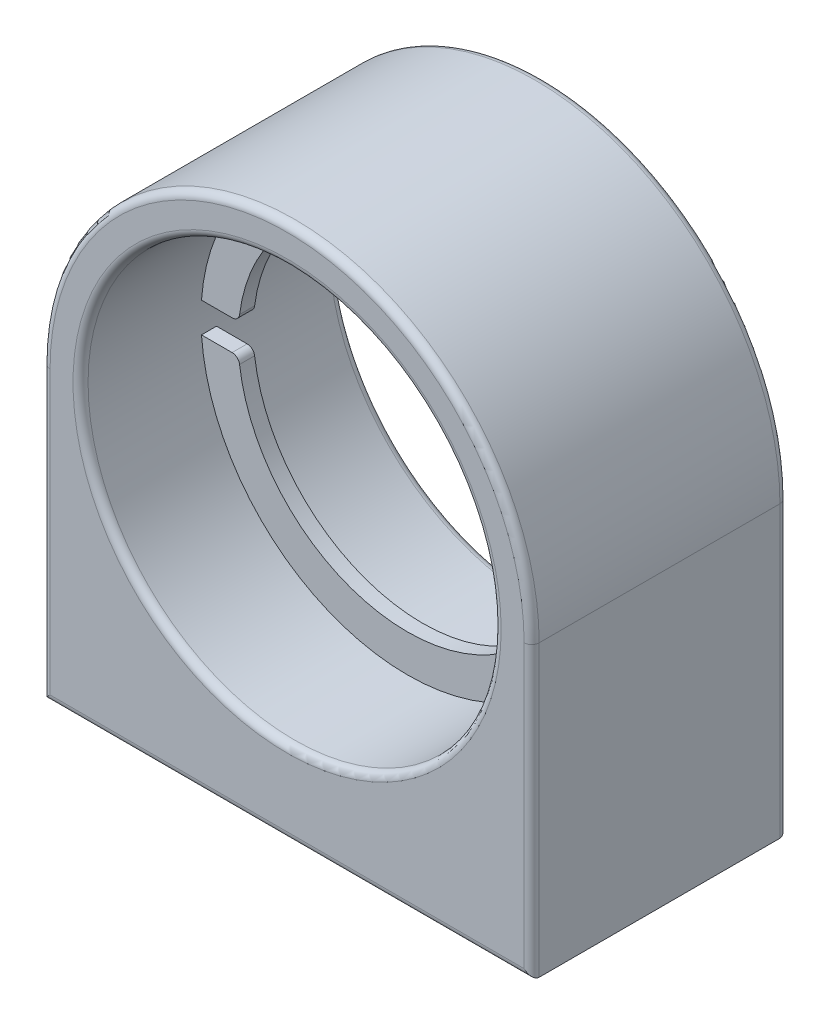
ISO-10303-21;
HEADER;
FILE_DESCRIPTION(('STEP AP214'),'2;1');
FILE_NAME('part.step','',(''),(''),'','','');
FILE_SCHEMA(('AUTOMOTIVE_DESIGN { 1 0 10303 214 1 1 1 1 }'));
ENDSEC;
DATA;
#1=APPLICATION_CONTEXT('core data for automotive mechanical design processes');
#2=APPLICATION_PROTOCOL_DEFINITION('international standard','automotive_design',2000,#1);
#3=PRODUCT_CONTEXT('',#1,'mechanical');
#4=PRODUCT('Part','Part','',(#3));
#5=PRODUCT_RELATED_PRODUCT_CATEGORY('part','',(#4));
#6=PRODUCT_DEFINITION_FORMATION('','',#4);
#7=PRODUCT_DEFINITION_CONTEXT('part definition',#1,'design');
#8=PRODUCT_DEFINITION('design','',#6,#7);
#9=PRODUCT_DEFINITION_SHAPE('','',#8);
#10=(LENGTH_UNIT() NAMED_UNIT(*) SI_UNIT(.MILLI.,.METRE.));
#11=(NAMED_UNIT(*) PLANE_ANGLE_UNIT() SI_UNIT($,.RADIAN.));
#12=(NAMED_UNIT(*) SI_UNIT($,.STERADIAN.) SOLID_ANGLE_UNIT());
#13=UNCERTAINTY_MEASURE_WITH_UNIT(LENGTH_MEASURE(1.E-05),#10,'distance_accuracy_value','');
#14=(GEOMETRIC_REPRESENTATION_CONTEXT(3) GLOBAL_UNCERTAINTY_ASSIGNED_CONTEXT((#13)) GLOBAL_UNIT_ASSIGNED_CONTEXT((#10,
#11,#12)) REPRESENTATION_CONTEXT('',''));
#15=CARTESIAN_POINT('',(0.,0.,0.));
#16=DIRECTION('',(0.,0.,1.));
#17=DIRECTION('',(1.,0.,0.));
#18=AXIS2_PLACEMENT_3D('',#15,#16,#17);
#19=CARTESIAN_POINT('',(0.,19.25,17.));
#20=DIRECTION('',(0.,0.,-1.));
#21=DIRECTION('',(-1.,0.,0.));
#22=AXIS2_PLACEMENT_3D('',#19,#20,#21);
#23=CYLINDRICAL_SURFACE('',#22,22.5);
#24=CARTESIAN_POINT('',(0.,19.25,-1.));
#25=DIRECTION('',(0.,0.,-1.));
#26=DIRECTION('',(-1.,0.,0.));
#27=AXIS2_PLACEMENT_3D('',#24,#25,#26);
#28=CIRCLE('',#27,22.5);
#29=CARTESIAN_POINT('',(-22.3159059972894,22.1223404255319,-1.));
#30=VERTEX_POINT('',#29);
#31=CARTESIAN_POINT('',(22.3159059972894,22.1223404255319,-1.));
#32=VERTEX_POINT('',#31);
#33=EDGE_CURVE('E243',#30,#32,#28,.T.);
#34=ORIENTED_EDGE('',*,*,#33,.T.);
#35=DIRECTION('',(0.,0.,-1.));
#36=VECTOR('',#35,1.);
#37=CARTESIAN_POINT('',(22.3159059972894,22.1223404255319,17.));
#38=LINE('',#37,#36);
#39=CARTESIAN_POINT('',(22.3159059972894,22.1223404255319,1.));
#40=VERTEX_POINT('',#39);
#41=EDGE_CURVE('E323',#32,#40,#38,.F.);
#42=ORIENTED_EDGE('',*,*,#41,.T.);
#43=CARTESIAN_POINT('',(0.,19.25,1.));
#44=DIRECTION('',(0.,0.,1.));
#45=DIRECTION('',(1.,0.,0.));
#46=AXIS2_PLACEMENT_3D('',#43,#44,#45);
#47=CIRCLE('',#46,22.5);
#48=CARTESIAN_POINT('',(-22.3159059972894,22.1223404255319,1.));
#49=VERTEX_POINT('',#48);
#50=EDGE_CURVE('E231',#40,#49,#47,.T.);
#51=ORIENTED_EDGE('',*,*,#50,.T.);
#52=DIRECTION('',(0.,0.,-1.));
#53=VECTOR('',#52,1.);
#54=CARTESIAN_POINT('',(-22.3159059972894,22.1223404255319,17.));
#55=LINE('',#54,#53);
#56=EDGE_CURVE('E321',#49,#30,#55,.T.);
#57=ORIENTED_EDGE('',*,*,#56,.T.);
#58=EDGE_LOOP('',(#34,#42,#51,#57));
#59=FACE_BOUND('',#58,.T.);
#60=ADVANCED_FACE('F41',(#59),#23,.F.);
#61=CARTESIAN_POINT('',(0.,19.25,1.));
#62=DIRECTION('',(0.,0.,1.));
#63=DIRECTION('',(1.,0.,0.));
#64=AXIS2_PLACEMENT_3D('',#61,#62,#63);
#65=PLANE('',#64);
#66=ORIENTED_EDGE('',*,*,#50,.F.);
#67=CARTESIAN_POINT('',(23.3077240416133,22.25,1.));
#68=DIRECTION('',(0.,0.,1.));
#69=DIRECTION('',(1.,0.,0.));
#70=AXIS2_PLACEMENT_3D('',#67,#68,#69);
#71=CIRCLE('',#70,1.);
#72=CARTESIAN_POINT('',(23.3077240416133,21.25,1.));
#73=VERTEX_POINT('',#72);
#74=EDGE_CURVE('E328',#40,#73,#71,.T.);
#75=ORIENTED_EDGE('',*,*,#74,.T.);
#76=DIRECTION('',(1.,0.,0.));
#77=VECTOR('',#76,1.);
#78=CARTESIAN_POINT('',(0.,21.25,1.));
#79=LINE('',#78,#77);
#80=CARTESIAN_POINT('',(27.3770433027382,21.25,1.));
#81=VERTEX_POINT('',#80);
#82=EDGE_CURVE('E476',#73,#81,#79,.T.);
#83=ORIENTED_EDGE('',*,*,#82,.T.);
#84=CARTESIAN_POINT('',(0.,19.25,1.));
#85=DIRECTION('',(0.,0.,1.));
#86=DIRECTION('',(1.,0.,0.));
#87=AXIS2_PLACEMENT_3D('',#84,#85,#86);
#88=CIRCLE('',#87,27.45);
#89=CARTESIAN_POINT('',(-27.3770433027382,21.25,1.));
#90=VERTEX_POINT('',#89);
#91=EDGE_CURVE('E223',#81,#90,#88,.T.);
#92=ORIENTED_EDGE('',*,*,#91,.T.);
#93=DIRECTION('',(1.,0.,0.));
#94=VECTOR('',#93,1.);
#95=CARTESIAN_POINT('',(0.,21.25,1.));
#96=LINE('',#95,#94);
#97=CARTESIAN_POINT('',(-23.3077240416133,21.25,1.));
#98=VERTEX_POINT('',#97);
#99=EDGE_CURVE('E484',#90,#98,#96,.T.);
#100=ORIENTED_EDGE('',*,*,#99,.T.);
#101=CARTESIAN_POINT('',(-23.3077240416133,22.25,1.));
#102=DIRECTION('',(0.,0.,1.));
#103=DIRECTION('',(1.,0.,0.));
#104=AXIS2_PLACEMENT_3D('',#101,#102,#103);
#105=CIRCLE('',#104,1.);
#106=EDGE_CURVE('E326',#98,#49,#105,.T.);
#107=ORIENTED_EDGE('',*,*,#106,.T.);
#108=EDGE_LOOP('',(#66,#75,#83,#92,#100,#107));
#109=FACE_BOUND('',#108,.T.);
#110=ADVANCED_FACE('F432',(#109),#65,.T.);
#111=CARTESIAN_POINT('',(0.,19.25,-1.));
#112=DIRECTION('',(0.,0.,-1.));
#113=DIRECTION('',(1.,0.,0.));
#114=AXIS2_PLACEMENT_3D('',#111,#112,#113);
#115=PLANE('',#114);
#116=DIRECTION('',(1.,0.,0.));
#117=VECTOR('',#116,1.);
#118=CARTESIAN_POINT('',(0.,21.25,-1.));
#119=LINE('',#118,#117);
#120=CARTESIAN_POINT('',(23.3077240416133,21.25,-1.));
#121=VERTEX_POINT('',#120);
#122=CARTESIAN_POINT('',(27.3770433027382,21.25,-1.));
#123=VERTEX_POINT('',#122);
#124=EDGE_CURVE('E356',#121,#123,#119,.T.);
#125=ORIENTED_EDGE('',*,*,#124,.F.);
#126=CARTESIAN_POINT('',(23.3077240416133,22.25,-1.));
#127=DIRECTION('',(0.,0.,-1.));
#128=DIRECTION('',(-1.,0.,0.));
#129=AXIS2_PLACEMENT_3D('',#126,#127,#128);
#130=CIRCLE('',#129,1.);
#131=EDGE_CURVE('E332',#121,#32,#130,.T.);
#132=ORIENTED_EDGE('',*,*,#131,.T.);
#133=ORIENTED_EDGE('',*,*,#33,.F.);
#134=CARTESIAN_POINT('',(-23.3077240416133,22.25,-1.));
#135=DIRECTION('',(0.,0.,-1.));
#136=DIRECTION('',(-1.,0.,0.));
#137=AXIS2_PLACEMENT_3D('',#134,#135,#136);
#138=CIRCLE('',#137,1.);
#139=CARTESIAN_POINT('',(-23.3077240416133,21.25,-1.));
#140=VERTEX_POINT('',#139);
#141=EDGE_CURVE('E58',#30,#140,#138,.T.);
#142=ORIENTED_EDGE('',*,*,#141,.T.);
#143=DIRECTION('',(1.,0.,0.));
#144=VECTOR('',#143,1.);
#145=CARTESIAN_POINT('',(0.,21.25,-1.));
#146=LINE('',#145,#144);
#147=CARTESIAN_POINT('',(-27.3770433027382,21.25,-1.));
#148=VERTEX_POINT('',#147);
#149=EDGE_CURVE('E493',#148,#140,#146,.T.);
#150=ORIENTED_EDGE('',*,*,#149,.F.);
#151=CARTESIAN_POINT('',(0.,19.25,-1.));
#152=DIRECTION('',(0.,0.,1.));
#153=DIRECTION('',(1.,0.,0.));
#154=AXIS2_PLACEMENT_3D('',#151,#152,#153);
#155=CIRCLE('',#154,27.45);
#156=EDGE_CURVE('E211',#123,#148,#155,.T.);
#157=ORIENTED_EDGE('',*,*,#156,.F.);
#158=EDGE_LOOP('',(#125,#132,#133,#142,#150,#157));
#159=FACE_BOUND('',#158,.T.);
#160=ADVANCED_FACE('F440',(#159),#115,.T.);
#161=CARTESIAN_POINT('',(-22.3159059972894,16.3776595744681,1.));
#162=VERTEX_POINT('',#161);
#163=CARTESIAN_POINT('',(22.3159059972894,16.3776595744681,1.));
#164=VERTEX_POINT('',#163);
#165=EDGE_CURVE('E226',#162,#164,#47,.T.);
#166=ORIENTED_EDGE('',*,*,#165,.T.);
#167=DIRECTION('',(0.,0.,-1.));
#168=VECTOR('',#167,1.);
#169=CARTESIAN_POINT('',(22.3159059972894,16.3776595744681,17.));
#170=LINE('',#169,#168);
#171=CARTESIAN_POINT('',(22.3159059972894,16.3776595744681,-1.));
#172=VERTEX_POINT('',#171);
#173=EDGE_CURVE('E315',#164,#172,#170,.T.);
#174=ORIENTED_EDGE('',*,*,#173,.T.);
#175=CARTESIAN_POINT('',(-22.3159059972894,16.3776595744681,-1.));
#176=VERTEX_POINT('',#175);
#177=EDGE_CURVE('E215',#172,#176,#28,.T.);
#178=ORIENTED_EDGE('',*,*,#177,.T.);
#179=DIRECTION('',(0.,0.,-1.));
#180=VECTOR('',#179,1.);
#181=CARTESIAN_POINT('',(-22.3159059972894,16.3776595744681,17.));
#182=LINE('',#181,#180);
#183=EDGE_CURVE('E312',#176,#162,#182,.F.);
#184=ORIENTED_EDGE('',*,*,#183,.T.);
#185=EDGE_LOOP('',(#166,#174,#178,#184));
#186=FACE_BOUND('',#185,.T.);
#187=ADVANCED_FACE('F435',(#186),#23,.F.);
#188=CARTESIAN_POINT('',(0.,19.25,17.));
#189=DIRECTION('',(0.,0.,-1.));
#190=DIRECTION('',(-1.,0.,0.));
#191=AXIS2_PLACEMENT_3D('',#188,#189,#190);
#192=CYLINDRICAL_SURFACE('',#191,32.5);
#193=DIRECTION('',(0.,0.,-1.));
#194=VECTOR('',#193,1.);
#195=CARTESIAN_POINT('',(32.5,19.25,17.));
#196=LINE('',#195,#194);
#197=CARTESIAN_POINT('',(32.5,19.25,16.));
#198=VERTEX_POINT('',#197);
#199=CARTESIAN_POINT('',(32.5,19.25,-16.));
#200=VERTEX_POINT('',#199);
#201=EDGE_CURVE('E227',#198,#200,#196,.T.);
#202=ORIENTED_EDGE('',*,*,#201,.T.);
#203=CARTESIAN_POINT('',(0.,19.25,-16.));
#204=DIRECTION('',(0.,0.,1.));
#205=DIRECTION('',(1.,0.,0.));
#206=AXIS2_PLACEMENT_3D('',#203,#204,#205);
#207=CIRCLE('',#206,32.5);
#208=CARTESIAN_POINT('',(-32.5,19.25,-16.));
#209=VERTEX_POINT('',#208);
#210=EDGE_CURVE('E285',#200,#209,#207,.T.);
#211=ORIENTED_EDGE('',*,*,#210,.T.);
#212=DIRECTION('',(0.,0.,-1.));
#213=VECTOR('',#212,1.);
#214=CARTESIAN_POINT('',(-32.5,19.25,17.));
#215=LINE('',#214,#213);
#216=CARTESIAN_POINT('',(-32.5,19.25,16.));
#217=VERTEX_POINT('',#216);
#218=EDGE_CURVE('E237',#217,#209,#215,.T.);
#219=ORIENTED_EDGE('',*,*,#218,.F.);
#220=CARTESIAN_POINT('',(0.,19.25,16.));
#221=DIRECTION('',(0.,0.,1.));
#222=DIRECTION('',(1.,0.,0.));
#223=AXIS2_PLACEMENT_3D('',#220,#221,#222);
#224=CIRCLE('',#223,32.5);
#225=EDGE_CURVE('E283',#217,#198,#224,.F.);
#226=ORIENTED_EDGE('',*,*,#225,.T.);
#227=EDGE_LOOP('',(#202,#211,#219,#226));
#228=FACE_BOUND('',#227,.T.);
#229=ADVANCED_FACE('F383',(#228),#192,.T.);
#230=CARTESIAN_POINT('',(-32.5,0.,17.));
#231=DIRECTION('',(-1.,0.,0.));
#232=DIRECTION('',(0.,0.,1.));
#233=AXIS2_PLACEMENT_3D('',#230,#231,#232);
#234=PLANE('',#233);
#235=ORIENTED_EDGE('',*,*,#218,.T.);
#236=DIRECTION('',(0.,1.,0.));
#237=VECTOR('',#236,1.);
#238=CARTESIAN_POINT('',(-32.5,-19.25,-16.));
#239=LINE('',#238,#237);
#240=CARTESIAN_POINT('',(-32.5,-19.25,-16.));
#241=VERTEX_POINT('',#240);
#242=EDGE_CURVE('E259',#209,#241,#239,.F.);
#243=ORIENTED_EDGE('',*,*,#242,.T.);
#244=DIRECTION('',(0.,0.,-1.));
#245=VECTOR('',#244,1.);
#246=CARTESIAN_POINT('',(-32.5,-19.25,17.));
#247=LINE('',#246,#245);
#248=CARTESIAN_POINT('',(-32.5,-19.25,16.));
#249=VERTEX_POINT('',#248);
#250=EDGE_CURVE('E234',#249,#241,#247,.T.);
#251=ORIENTED_EDGE('',*,*,#250,.F.);
#252=DIRECTION('',(0.,1.,0.));
#253=VECTOR('',#252,1.);
#254=CARTESIAN_POINT('',(-32.5,0.,16.));
#255=LINE('',#254,#253);
#256=EDGE_CURVE('E257',#249,#217,#255,.T.);
#257=ORIENTED_EDGE('',*,*,#256,.T.);
#258=EDGE_LOOP('',(#235,#243,#251,#257));
#259=FACE_BOUND('',#258,.T.);
#260=ADVANCED_FACE('F380',(#259),#234,.T.);
#261=CARTESIAN_POINT('',(0.,-19.25,17.));
#262=DIRECTION('',(0.,1.,0.));
#263=DIRECTION('',(0.,0.,1.));
#264=AXIS2_PLACEMENT_3D('',#261,#262,#263);
#265=PLANE('',#264);
#266=CARTESIAN_POINT('',(22.5,-19.25,0.));
#267=DIRECTION('',(0.,1.,0.));
#268=DIRECTION('',(0.,0.,1.));
#269=AXIS2_PLACEMENT_3D('',#266,#267,#268);
#270=CIRCLE('',#269,3.8);
#271=CARTESIAN_POINT('',(22.5,-19.25,3.8));
#272=VERTEX_POINT('',#271);
#273=EDGE_CURVE('E271',#272,#272,#270,.T.);
#274=ORIENTED_EDGE('',*,*,#273,.T.);
#275=EDGE_LOOP('',(#274));
#276=FACE_BOUND('',#275,.T.);
#277=CARTESIAN_POINT('',(10.,-19.25,0.));
#278=DIRECTION('',(0.,1.,0.));
#279=DIRECTION('',(0.,0.,1.));
#280=AXIS2_PLACEMENT_3D('',#277,#278,#279);
#281=CIRCLE('',#280,3.8);
#282=CARTESIAN_POINT('',(10.,-19.25,3.8));
#283=VERTEX_POINT('',#282);
#284=EDGE_CURVE('E268',#283,#283,#281,.T.);
#285=ORIENTED_EDGE('',*,*,#284,.T.);
#286=EDGE_LOOP('',(#285));
#287=FACE_BOUND('',#286,.T.);
#288=CARTESIAN_POINT('',(-10.,-19.25,0.));
#289=DIRECTION('',(0.,1.,0.));
#290=DIRECTION('',(0.,0.,1.));
#291=AXIS2_PLACEMENT_3D('',#288,#289,#290);
#292=CIRCLE('',#291,3.8);
#293=CARTESIAN_POINT('',(-10.,-19.25,3.8));
#294=VERTEX_POINT('',#293);
#295=EDGE_CURVE('E265',#294,#294,#292,.T.);
#296=ORIENTED_EDGE('',*,*,#295,.T.);
#297=EDGE_LOOP('',(#296));
#298=FACE_BOUND('',#297,.T.);
#299=CARTESIAN_POINT('',(-22.5,-19.25,0.));
#300=DIRECTION('',(0.,1.,0.));
#301=DIRECTION('',(0.,0.,1.));
#302=AXIS2_PLACEMENT_3D('',#299,#300,#301);
#303=CIRCLE('',#302,3.8);
#304=CARTESIAN_POINT('',(-22.5,-19.25,3.8));
#305=VERTEX_POINT('',#304);
#306=EDGE_CURVE('E262',#305,#305,#303,.T.);
#307=ORIENTED_EDGE('',*,*,#306,.T.);
#308=EDGE_LOOP('',(#307));
#309=FACE_BOUND('',#308,.T.);
#310=ORIENTED_EDGE('',*,*,#250,.T.);
#311=DIRECTION('',(1.,0.,0.));
#312=VECTOR('',#311,1.);
#313=CARTESIAN_POINT('',(0.,-19.25,-16.));
#314=LINE('',#313,#312);
#315=CARTESIAN_POINT('',(32.5,-19.25,-16.));
#316=VERTEX_POINT('',#315);
#317=EDGE_CURVE('E276',#241,#316,#314,.T.);
#318=ORIENTED_EDGE('',*,*,#317,.T.);
#319=DIRECTION('',(0.,0.,-1.));
#320=VECTOR('',#319,1.);
#321=CARTESIAN_POINT('',(32.5,-19.25,17.));
#322=LINE('',#321,#320);
#323=CARTESIAN_POINT('',(32.5,-19.25,16.));
#324=VERTEX_POINT('',#323);
#325=EDGE_CURVE('E230',#324,#316,#322,.T.);
#326=ORIENTED_EDGE('',*,*,#325,.F.);
#327=DIRECTION('',(1.,0.,0.));
#328=VECTOR('',#327,1.);
#329=CARTESIAN_POINT('',(-32.5,-19.25,16.));
#330=LINE('',#329,#328);
#331=EDGE_CURVE('E274',#324,#249,#330,.F.);
#332=ORIENTED_EDGE('',*,*,#331,.T.);
#333=EDGE_LOOP('',(#310,#318,#326,#332));
#334=FACE_BOUND('',#333,.T.);
#335=ADVANCED_FACE('F397',(#276,#287,#298,#309,#334),#265,.F.);
#336=CARTESIAN_POINT('',(32.5,0.,17.));
#337=DIRECTION('',(-1.,0.,0.));
#338=DIRECTION('',(0.,0.,1.));
#339=AXIS2_PLACEMENT_3D('',#336,#337,#338);
#340=PLANE('',#339);
#341=ORIENTED_EDGE('',*,*,#325,.T.);
#342=DIRECTION('',(0.,1.,0.));
#343=VECTOR('',#342,1.);
#344=CARTESIAN_POINT('',(32.5,0.,-16.));
#345=LINE('',#344,#343);
#346=EDGE_CURVE('E281',#316,#200,#345,.T.);
#347=ORIENTED_EDGE('',*,*,#346,.T.);
#348=ORIENTED_EDGE('',*,*,#201,.F.);
#349=DIRECTION('',(0.,1.,0.));
#350=VECTOR('',#349,1.);
#351=CARTESIAN_POINT('',(32.5,-19.25,16.));
#352=LINE('',#351,#350);
#353=EDGE_CURVE('E278',#198,#324,#352,.F.);
#354=ORIENTED_EDGE('',*,*,#353,.T.);
#355=EDGE_LOOP('',(#341,#347,#348,#354));
#356=FACE_BOUND('',#355,.T.);
#357=ADVANCED_FACE('F401',(#356),#340,.F.);
#358=CARTESIAN_POINT('',(0.,0.,17.));
#359=DIRECTION('',(0.,0.,1.));
#360=DIRECTION('',(1.,0.,0.));
#361=AXIS2_PLACEMENT_3D('',#358,#359,#360);
#362=PLANE('',#361);
#363=DIRECTION('',(1.,0.,0.));
#364=VECTOR('',#363,1.);
#365=CARTESIAN_POINT('',(32.5,-18.25,17.));
#366=LINE('',#365,#364);
#367=CARTESIAN_POINT('',(-31.5,-18.25,17.));
#368=VERTEX_POINT('',#367);
#369=CARTESIAN_POINT('',(31.5,-18.25,17.));
#370=VERTEX_POINT('',#369);
#371=EDGE_CURVE('E300',#368,#370,#366,.T.);
#372=ORIENTED_EDGE('',*,*,#371,.T.);
#373=DIRECTION('',(0.,1.,0.));
#374=VECTOR('',#373,1.);
#375=CARTESIAN_POINT('',(31.5,19.25,17.));
#376=LINE('',#375,#374);
#377=CARTESIAN_POINT('',(31.5,19.25,17.));
#378=VERTEX_POINT('',#377);
#379=EDGE_CURVE('E302',#370,#378,#376,.T.);
#380=ORIENTED_EDGE('',*,*,#379,.T.);
#381=CARTESIAN_POINT('',(0.,19.25,17.));
#382=DIRECTION('',(0.,0.,1.));
#383=DIRECTION('',(1.,0.,0.));
#384=AXIS2_PLACEMENT_3D('',#381,#382,#383);
#385=CIRCLE('',#384,31.5);
#386=CARTESIAN_POINT('',(-31.5,19.25,17.));
#387=VERTEX_POINT('',#386);
#388=EDGE_CURVE('E296',#378,#387,#385,.T.);
#389=ORIENTED_EDGE('',*,*,#388,.T.);
#390=DIRECTION('',(0.,1.,0.));
#391=VECTOR('',#390,1.);
#392=CARTESIAN_POINT('',(-31.5,0.,17.));
#393=LINE('',#392,#391);
#394=EDGE_CURVE('E298',#387,#368,#393,.F.);
#395=ORIENTED_EDGE('',*,*,#394,.T.);
#396=EDGE_LOOP('',(#372,#380,#389,#395));
#397=FACE_BOUND('',#396,.T.);
#398=CARTESIAN_POINT('',(0.,19.25,17.));
#399=DIRECTION('',(0.,0.,1.));
#400=DIRECTION('',(1.,0.,0.));
#401=AXIS2_PLACEMENT_3D('',#398,#399,#400);
#402=CIRCLE('',#401,28.45);
#403=CARTESIAN_POINT('',(28.45,19.25,17.));
#404=VERTEX_POINT('',#403);
#405=EDGE_CURVE('E293',#404,#404,#402,.F.);
#406=ORIENTED_EDGE('',*,*,#405,.T.);
#407=EDGE_LOOP('',(#406));
#408=FACE_BOUND('',#407,.T.);
#409=ADVANCED_FACE('F414',(#397,#408),#362,.T.);
#410=CARTESIAN_POINT('',(0.,0.,-17.));
#411=DIRECTION('',(0.,0.,1.));
#412=DIRECTION('',(1.,0.,0.));
#413=AXIS2_PLACEMENT_3D('',#410,#411,#412);
#414=PLANE('',#413);
#415=DIRECTION('',(1.,0.,0.));
#416=VECTOR('',#415,1.);
#417=CARTESIAN_POINT('',(0.,-18.25,-17.));
#418=LINE('',#417,#416);
#419=CARTESIAN_POINT('',(31.5,-18.25,-17.));
#420=VERTEX_POINT('',#419);
#421=CARTESIAN_POINT('',(-31.5,-18.25,-17.));
#422=VERTEX_POINT('',#421);
#423=EDGE_CURVE('E252',#420,#422,#418,.F.);
#424=ORIENTED_EDGE('',*,*,#423,.T.);
#425=DIRECTION('',(0.,1.,0.));
#426=VECTOR('',#425,1.);
#427=CARTESIAN_POINT('',(-31.5,19.25,-17.));
#428=LINE('',#427,#426);
#429=CARTESIAN_POINT('',(-31.5,19.25,-17.));
#430=VERTEX_POINT('',#429);
#431=EDGE_CURVE('E254',#422,#430,#428,.T.);
#432=ORIENTED_EDGE('',*,*,#431,.T.);
#433=CARTESIAN_POINT('',(0.,19.25,-17.));
#434=DIRECTION('',(0.,0.,1.));
#435=DIRECTION('',(1.,0.,0.));
#436=AXIS2_PLACEMENT_3D('',#433,#434,#435);
#437=CIRCLE('',#436,31.5);
#438=CARTESIAN_POINT('',(31.5,19.25,-17.));
#439=VERTEX_POINT('',#438);
#440=EDGE_CURVE('E248',#430,#439,#437,.F.);
#441=ORIENTED_EDGE('',*,*,#440,.T.);
#442=DIRECTION('',(0.,1.,0.));
#443=VECTOR('',#442,1.);
#444=CARTESIAN_POINT('',(31.5,0.,-17.));
#445=LINE('',#444,#443);
#446=EDGE_CURVE('E250',#439,#420,#445,.F.);
#447=ORIENTED_EDGE('',*,*,#446,.T.);
#448=EDGE_LOOP('',(#424,#432,#441,#447));
#449=FACE_BOUND('',#448,.T.);
#450=CARTESIAN_POINT('',(0.,19.25,-17.));
#451=DIRECTION('',(0.,0.,1.));
#452=DIRECTION('',(1.,0.,0.));
#453=AXIS2_PLACEMENT_3D('',#450,#451,#452);
#454=CIRCLE('',#453,28.45);
#455=CARTESIAN_POINT('',(28.45,19.25,-17.));
#456=VERTEX_POINT('',#455);
#457=EDGE_CURVE('E240',#456,#456,#454,.T.);
#458=ORIENTED_EDGE('',*,*,#457,.T.);
#459=EDGE_LOOP('',(#458));
#460=FACE_BOUND('',#459,.T.);
#461=ADVANCED_FACE('F411',(#449,#460),#414,.F.);
#462=CARTESIAN_POINT('',(0.,19.25,1.));
#463=DIRECTION('',(0.,0.,1.));
#464=DIRECTION('',(1.,0.,0.));
#465=AXIS2_PLACEMENT_3D('',#462,#463,#464);
#466=CYLINDRICAL_SURFACE('',#465,27.45);
#467=CARTESIAN_POINT('',(0.,19.25,-16.));
#468=DIRECTION('',(0.,0.,1.));
#469=DIRECTION('',(1.,0.,0.));
#470=AXIS2_PLACEMENT_3D('',#467,#468,#469);
#471=CIRCLE('',#470,27.45);
#472=CARTESIAN_POINT('',(27.45,19.25,-16.));
#473=VERTEX_POINT('',#472);
#474=EDGE_CURVE('E290',#473,#473,#471,.F.);
#475=ORIENTED_EDGE('',*,*,#474,.T.);
#476=EDGE_LOOP('',(#475));
#477=FACE_BOUND('',#476,.T.);
#478=CARTESIAN_POINT('',(0.,19.25,16.));
#479=DIRECTION('',(0.,0.,1.));
#480=DIRECTION('',(1.,0.,0.));
#481=AXIS2_PLACEMENT_3D('',#478,#479,#480);
#482=CIRCLE('',#481,27.45);
#483=CARTESIAN_POINT('',(27.45,19.25,16.));
#484=VERTEX_POINT('',#483);
#485=EDGE_CURVE('E287',#484,#484,#482,.T.);
#486=ORIENTED_EDGE('',*,*,#485,.T.);
#487=EDGE_LOOP('',(#486));
#488=FACE_BOUND('',#487,.T.);
#489=CARTESIAN_POINT('',(-27.3770433027382,17.25,1.));
#490=VERTEX_POINT('',#489);
#491=CARTESIAN_POINT('',(27.3770433027382,17.25,1.));
#492=VERTEX_POINT('',#491);
#493=EDGE_CURVE('E203',#490,#492,#88,.T.);
#494=ORIENTED_EDGE('',*,*,#493,.F.);
#495=DIRECTION('',(0.,0.,1.));
#496=VECTOR('',#495,1.);
#497=CARTESIAN_POINT('',(-27.3770433027382,17.25,-7.43367529311809));
#498=LINE('',#497,#496);
#499=CARTESIAN_POINT('',(-27.3770433027382,17.25,-1.));
#500=VERTEX_POINT('',#499);
#501=EDGE_CURVE('E186',#500,#490,#498,.T.);
#502=ORIENTED_EDGE('',*,*,#501,.F.);
#503=CARTESIAN_POINT('',(27.3770433027382,17.25,-1.));
#504=VERTEX_POINT('',#503);
#505=EDGE_CURVE('E201',#500,#504,#155,.T.);
#506=ORIENTED_EDGE('',*,*,#505,.T.);
#507=DIRECTION('',(0.,0.,1.));
#508=VECTOR('',#507,1.);
#509=CARTESIAN_POINT('',(27.3770433027382,17.25,-7.43367529311809));
#510=LINE('',#509,#508);
#511=EDGE_CURVE('E466',#504,#492,#510,.T.);
#512=ORIENTED_EDGE('',*,*,#511,.T.);
#513=EDGE_LOOP('',(#494,#502,#506,#512));
#514=FACE_BOUND('',#513,.T.);
#515=ORIENTED_EDGE('',*,*,#91,.F.);
#516=DIRECTION('',(0.,0.,1.));
#517=VECTOR('',#516,1.);
#518=CARTESIAN_POINT('',(27.3770433027382,21.25,-7.43367529311809));
#519=LINE('',#518,#517);
#520=EDGE_CURVE('E469',#123,#81,#519,.T.);
#521=ORIENTED_EDGE('',*,*,#520,.F.);
#522=ORIENTED_EDGE('',*,*,#156,.T.);
#523=DIRECTION('',(0.,0.,1.));
#524=VECTOR('',#523,1.);
#525=CARTESIAN_POINT('',(-27.3770433027382,21.25,-7.43367529311809));
#526=LINE('',#525,#524);
#527=EDGE_CURVE('E193',#148,#90,#526,.T.);
#528=ORIENTED_EDGE('',*,*,#527,.T.);
#529=EDGE_LOOP('',(#515,#521,#522,#528));
#530=FACE_BOUND('',#529,.T.);
#531=ADVANCED_FACE('F198',(#477,#488,#514,#530),#466,.F.);
#532=DIRECTION('',(1.,0.,0.));
#533=VECTOR('',#532,1.);
#534=CARTESIAN_POINT('',(0.,17.25,1.));
#535=LINE('',#534,#533);
#536=CARTESIAN_POINT('',(23.3077240416133,17.25,1.));
#537=VERTEX_POINT('',#536);
#538=EDGE_CURVE('E467',#537,#492,#535,.T.);
#539=ORIENTED_EDGE('',*,*,#538,.F.);
#540=CARTESIAN_POINT('',(23.3077240416133,16.25,1.));
#541=DIRECTION('',(0.,0.,1.));
#542=DIRECTION('',(1.,0.,0.));
#543=AXIS2_PLACEMENT_3D('',#540,#541,#542);
#544=CIRCLE('',#543,1.);
#545=EDGE_CURVE('E310',#537,#164,#544,.T.);
#546=ORIENTED_EDGE('',*,*,#545,.T.);
#547=ORIENTED_EDGE('',*,*,#165,.F.);
#548=CARTESIAN_POINT('',(-23.3077240416133,16.25,1.));
#549=DIRECTION('',(0.,0.,1.));
#550=DIRECTION('',(1.,0.,0.));
#551=AXIS2_PLACEMENT_3D('',#548,#549,#550);
#552=CIRCLE('',#551,1.);
#553=CARTESIAN_POINT('',(-23.3077240416133,17.25,1.));
#554=VERTEX_POINT('',#553);
#555=EDGE_CURVE('E308',#162,#554,#552,.T.);
#556=ORIENTED_EDGE('',*,*,#555,.T.);
#557=DIRECTION('',(1.,0.,0.));
#558=VECTOR('',#557,1.);
#559=CARTESIAN_POINT('',(0.,17.25,1.));
#560=LINE('',#559,#558);
#561=EDGE_CURVE('E204',#490,#554,#560,.T.);
#562=ORIENTED_EDGE('',*,*,#561,.F.);
#563=ORIENTED_EDGE('',*,*,#493,.T.);
#564=EDGE_LOOP('',(#539,#546,#547,#556,#562,#563));
#565=FACE_BOUND('',#564,.T.);
#566=ADVANCED_FACE('F443',(#565),#65,.T.);
#567=ORIENTED_EDGE('',*,*,#177,.F.);
#568=CARTESIAN_POINT('',(23.3077240416133,16.25,-1.));
#569=DIRECTION('',(0.,0.,-1.));
#570=DIRECTION('',(-1.,0.,0.));
#571=AXIS2_PLACEMENT_3D('',#568,#569,#570);
#572=CIRCLE('',#571,1.);
#573=CARTESIAN_POINT('',(23.3077240416133,17.25,-1.));
#574=VERTEX_POINT('',#573);
#575=EDGE_CURVE('E319',#172,#574,#572,.T.);
#576=ORIENTED_EDGE('',*,*,#575,.T.);
#577=DIRECTION('',(1.,0.,0.));
#578=VECTOR('',#577,1.);
#579=CARTESIAN_POINT('',(0.,17.25,-1.));
#580=LINE('',#579,#578);
#581=EDGE_CURVE('E209',#574,#504,#580,.T.);
#582=ORIENTED_EDGE('',*,*,#581,.T.);
#583=ORIENTED_EDGE('',*,*,#505,.F.);
#584=DIRECTION('',(1.,0.,0.));
#585=VECTOR('',#584,1.);
#586=CARTESIAN_POINT('',(0.,17.25,-1.));
#587=LINE('',#586,#585);
#588=CARTESIAN_POINT('',(-23.3077240416133,17.25,-1.));
#589=VERTEX_POINT('',#588);
#590=EDGE_CURVE('E182',#500,#589,#587,.T.);
#591=ORIENTED_EDGE('',*,*,#590,.T.);
#592=CARTESIAN_POINT('',(-23.3077240416133,16.25,-1.));
#593=DIRECTION('',(0.,0.,-1.));
#594=DIRECTION('',(-1.,0.,0.));
#595=AXIS2_PLACEMENT_3D('',#592,#593,#594);
#596=CIRCLE('',#595,1.);
#597=EDGE_CURVE('E317',#589,#176,#596,.T.);
#598=ORIENTED_EDGE('',*,*,#597,.T.);
#599=EDGE_LOOP('',(#567,#576,#582,#583,#591,#598));
#600=FACE_BOUND('',#599,.T.);
#601=ADVANCED_FACE('F207',(#600),#115,.T.);
#602=CARTESIAN_POINT('',(22.5,-8.25,0.));
#603=DIRECTION('',(0.,-1.,0.));
#604=DIRECTION('',(0.,0.,-1.));
#605=AXIS2_PLACEMENT_3D('',#602,#603,#604);
#606=CYLINDRICAL_SURFACE('',#605,2.8);
#607=CARTESIAN_POINT('',(22.5,-18.25,0.));
#608=DIRECTION('',(0.,1.,0.));
#609=DIRECTION('',(0.,0.,1.));
#610=AXIS2_PLACEMENT_3D('',#607,#608,#609);
#611=CIRCLE('',#610,2.8);
#612=CARTESIAN_POINT('',(22.5,-18.25,2.8));
#613=VERTEX_POINT('',#612);
#614=EDGE_CURVE('E338',#613,#613,#611,.F.);
#615=ORIENTED_EDGE('',*,*,#614,.T.);
#616=EDGE_LOOP('',(#615));
#617=FACE_BOUND('',#616,.T.);
#618=CARTESIAN_POINT('',(22.5,-8.25,0.));
#619=DIRECTION('',(0.,-1.,0.));
#620=DIRECTION('',(0.,0.,1.));
#621=AXIS2_PLACEMENT_3D('',#618,#619,#620);
#622=CIRCLE('',#621,2.8);
#623=CARTESIAN_POINT('',(22.5,-8.25,2.8));
#624=VERTEX_POINT('',#623);
#625=EDGE_CURVE('E221',#624,#624,#622,.T.);
#626=ORIENTED_EDGE('',*,*,#625,.F.);
#627=EDGE_LOOP('',(#626));
#628=FACE_BOUND('',#627,.T.);
#629=ADVANCED_FACE('F567',(#617,#628),#606,.F.);
#630=CARTESIAN_POINT('',(22.5,-8.25,0.));
#631=DIRECTION('',(0.,1.,0.));
#632=DIRECTION('',(0.,0.,1.));
#633=AXIS2_PLACEMENT_3D('',#630,#631,#632);
#634=PLANE('',#633);
#635=ORIENTED_EDGE('',*,*,#625,.T.);
#636=EDGE_LOOP('',(#635));
#637=FACE_BOUND('',#636,.T.);
#638=ADVANCED_FACE('F564',(#637),#634,.F.);
#639=CARTESIAN_POINT('',(10.,-8.25,0.));
#640=DIRECTION('',(0.,-1.,0.));
#641=DIRECTION('',(0.,0.,-1.));
#642=AXIS2_PLACEMENT_3D('',#639,#640,#641);
#643=CYLINDRICAL_SURFACE('',#642,2.8);
#644=CARTESIAN_POINT('',(10.,-18.25,0.));
#645=DIRECTION('',(0.,1.,0.));
#646=DIRECTION('',(0.,0.,1.));
#647=AXIS2_PLACEMENT_3D('',#644,#645,#646);
#648=CIRCLE('',#647,2.8);
#649=CARTESIAN_POINT('',(10.,-18.25,2.8));
#650=VERTEX_POINT('',#649);
#651=EDGE_CURVE('E341',#650,#650,#648,.F.);
#652=ORIENTED_EDGE('',*,*,#651,.T.);
#653=EDGE_LOOP('',(#652));
#654=FACE_BOUND('',#653,.T.);
#655=CARTESIAN_POINT('',(10.,-8.25,0.));
#656=DIRECTION('',(0.,-1.,0.));
#657=DIRECTION('',(0.,0.,1.));
#658=AXIS2_PLACEMENT_3D('',#655,#656,#657);
#659=CIRCLE('',#658,2.8);
#660=CARTESIAN_POINT('',(10.,-8.25,2.8));
#661=VERTEX_POINT('',#660);
#662=EDGE_CURVE('E479',#661,#661,#659,.T.);
#663=ORIENTED_EDGE('',*,*,#662,.F.);
#664=EDGE_LOOP('',(#663));
#665=FACE_BOUND('',#664,.T.);
#666=ADVANCED_FACE('F561',(#654,#665),#643,.F.);
#667=CARTESIAN_POINT('',(10.,-8.25,0.));
#668=DIRECTION('',(0.,1.,0.));
#669=DIRECTION('',(0.,0.,1.));
#670=AXIS2_PLACEMENT_3D('',#667,#668,#669);
#671=PLANE('',#670);
#672=ORIENTED_EDGE('',*,*,#662,.T.);
#673=EDGE_LOOP('',(#672));
#674=FACE_BOUND('',#673,.T.);
#675=ADVANCED_FACE('F546',(#674),#671,.F.);
#676=CARTESIAN_POINT('',(-10.,-8.25,0.));
#677=DIRECTION('',(0.,-1.,0.));
#678=DIRECTION('',(0.,0.,-1.));
#679=AXIS2_PLACEMENT_3D('',#676,#677,#678);
#680=CYLINDRICAL_SURFACE('',#679,2.8);
#681=CARTESIAN_POINT('',(-10.,-18.25,0.));
#682=DIRECTION('',(0.,1.,0.));
#683=DIRECTION('',(0.,0.,1.));
#684=AXIS2_PLACEMENT_3D('',#681,#682,#683);
#685=CIRCLE('',#684,2.8);
#686=CARTESIAN_POINT('',(-10.,-18.25,2.8));
#687=VERTEX_POINT('',#686);
#688=EDGE_CURVE('E50',#687,#687,#685,.F.);
#689=ORIENTED_EDGE('',*,*,#688,.T.);
#690=EDGE_LOOP('',(#689));
#691=FACE_BOUND('',#690,.T.);
#692=CARTESIAN_POINT('',(-10.,-8.25,0.));
#693=DIRECTION('',(0.,-1.,0.));
#694=DIRECTION('',(0.,0.,-1.));
#695=AXIS2_PLACEMENT_3D('',#692,#693,#694);
#696=CIRCLE('',#695,2.8);
#697=CARTESIAN_POINT('',(-10.,-8.25,-2.8));
#698=VERTEX_POINT('',#697);
#699=EDGE_CURVE('E217',#698,#698,#696,.T.);
#700=ORIENTED_EDGE('',*,*,#699,.F.);
#701=EDGE_LOOP('',(#700));
#702=FACE_BOUND('',#701,.T.);
#703=ADVANCED_FACE('F542',(#691,#702),#680,.F.);
#704=CARTESIAN_POINT('',(-10.,-8.25,0.));
#705=DIRECTION('',(0.,-1.,0.));
#706=DIRECTION('',(0.,0.,-1.));
#707=AXIS2_PLACEMENT_3D('',#704,#705,#706);
#708=PLANE('',#707);
#709=ORIENTED_EDGE('',*,*,#699,.T.);
#710=EDGE_LOOP('',(#709));
#711=FACE_BOUND('',#710,.T.);
#712=ADVANCED_FACE('F545',(#711),#708,.T.);
#713=CARTESIAN_POINT('',(-22.5,-8.25,0.));
#714=DIRECTION('',(0.,-1.,0.));
#715=DIRECTION('',(0.,0.,-1.));
#716=AXIS2_PLACEMENT_3D('',#713,#714,#715);
#717=CYLINDRICAL_SURFACE('',#716,2.8);
#718=CARTESIAN_POINT('',(-22.5,-18.25,0.));
#719=DIRECTION('',(0.,1.,0.));
#720=DIRECTION('',(0.,0.,1.));
#721=AXIS2_PLACEMENT_3D('',#718,#719,#720);
#722=CIRCLE('',#721,2.8);
#723=CARTESIAN_POINT('',(-22.5,-18.25,2.8));
#724=VERTEX_POINT('',#723);
#725=EDGE_CURVE('E11',#724,#724,#722,.F.);
#726=ORIENTED_EDGE('',*,*,#725,.T.);
#727=EDGE_LOOP('',(#726));
#728=FACE_BOUND('',#727,.T.);
#729=CARTESIAN_POINT('',(-22.5,-8.25,0.));
#730=DIRECTION('',(0.,-1.,0.));
#731=DIRECTION('',(0.,0.,-1.));
#732=AXIS2_PLACEMENT_3D('',#729,#730,#731);
#733=CIRCLE('',#732,2.8);
#734=CARTESIAN_POINT('',(-22.5,-8.25,-2.8));
#735=VERTEX_POINT('',#734);
#736=EDGE_CURVE('E212',#735,#735,#733,.T.);
#737=ORIENTED_EDGE('',*,*,#736,.F.);
#738=EDGE_LOOP('',(#737));
#739=FACE_BOUND('',#738,.T.);
#740=ADVANCED_FACE('F551',(#728,#739),#717,.F.);
#741=CARTESIAN_POINT('',(-22.5,-8.25,0.));
#742=DIRECTION('',(0.,-1.,0.));
#743=DIRECTION('',(0.,0.,-1.));
#744=AXIS2_PLACEMENT_3D('',#741,#742,#743);
#745=PLANE('',#744);
#746=ORIENTED_EDGE('',*,*,#736,.T.);
#747=EDGE_LOOP('',(#746));
#748=FACE_BOUND('',#747,.T.);
#749=ADVANCED_FACE('F557',(#748),#745,.T.);
#750=CARTESIAN_POINT('',(0.,17.25,-7.43367529311809));
#751=DIRECTION('',(0.,-1.,0.));
#752=DIRECTION('',(0.,0.,-1.));
#753=AXIS2_PLACEMENT_3D('',#750,#751,#752);
#754=PLANE('',#753);
#755=ORIENTED_EDGE('',*,*,#581,.F.);
#756=DIRECTION('',(0.,0.,1.));
#757=VECTOR('',#756,1.);
#758=CARTESIAN_POINT('',(23.3077240416133,17.25,1.));
#759=LINE('',#758,#757);
#760=EDGE_CURVE('E305',#574,#537,#759,.T.);
#761=ORIENTED_EDGE('',*,*,#760,.T.);
#762=ORIENTED_EDGE('',*,*,#538,.T.);
#763=ORIENTED_EDGE('',*,*,#511,.F.);
#764=EDGE_LOOP('',(#755,#761,#762,#763));
#765=FACE_BOUND('',#764,.T.);
#766=ADVANCED_FACE('F464',(#765),#754,.F.);
#767=CARTESIAN_POINT('',(0.,21.25,-7.43367529311809));
#768=DIRECTION('',(0.,-1.,0.));
#769=DIRECTION('',(0.,0.,-1.));
#770=AXIS2_PLACEMENT_3D('',#767,#768,#769);
#771=PLANE('',#770);
#772=ORIENTED_EDGE('',*,*,#82,.F.);
#773=DIRECTION('',(0.,0.,-1.));
#774=VECTOR('',#773,1.);
#775=CARTESIAN_POINT('',(23.3077240416133,21.25,-7.43367529311809));
#776=LINE('',#775,#774);
#777=EDGE_CURVE('E66',#73,#121,#776,.T.);
#778=ORIENTED_EDGE('',*,*,#777,.T.);
#779=ORIENTED_EDGE('',*,*,#124,.T.);
#780=ORIENTED_EDGE('',*,*,#520,.T.);
#781=EDGE_LOOP('',(#772,#778,#779,#780));
#782=FACE_BOUND('',#781,.T.);
#783=ADVANCED_FACE('F497',(#782),#771,.T.);
#784=CARTESIAN_POINT('',(0.,17.25,-7.43367529311809));
#785=DIRECTION('',(0.,-1.,0.));
#786=DIRECTION('',(0.,0.,-1.));
#787=AXIS2_PLACEMENT_3D('',#784,#785,#786);
#788=PLANE('',#787);
#789=ORIENTED_EDGE('',*,*,#561,.T.);
#790=DIRECTION('',(0.,0.,1.));
#791=VECTOR('',#790,1.);
#792=CARTESIAN_POINT('',(-23.3077240416133,17.25,-1.));
#793=LINE('',#792,#791);
#794=EDGE_CURVE('E189',#554,#589,#793,.F.);
#795=ORIENTED_EDGE('',*,*,#794,.T.);
#796=ORIENTED_EDGE('',*,*,#590,.F.);
#797=ORIENTED_EDGE('',*,*,#501,.T.);
#798=EDGE_LOOP('',(#789,#795,#796,#797));
#799=FACE_BOUND('',#798,.T.);
#800=ADVANCED_FACE('F185',(#799),#788,.F.);
#801=CARTESIAN_POINT('',(0.,21.25,-7.43367529311809));
#802=DIRECTION('',(0.,-1.,0.));
#803=DIRECTION('',(0.,0.,-1.));
#804=AXIS2_PLACEMENT_3D('',#801,#802,#803);
#805=PLANE('',#804);
#806=ORIENTED_EDGE('',*,*,#149,.T.);
#807=DIRECTION('',(0.,0.,-1.));
#808=VECTOR('',#807,1.);
#809=CARTESIAN_POINT('',(-23.3077240416133,21.25,-7.43367529311809));
#810=LINE('',#809,#808);
#811=EDGE_CURVE('E334',#140,#98,#810,.F.);
#812=ORIENTED_EDGE('',*,*,#811,.T.);
#813=ORIENTED_EDGE('',*,*,#99,.F.);
#814=ORIENTED_EDGE('',*,*,#527,.F.);
#815=EDGE_LOOP('',(#806,#812,#813,#814));
#816=FACE_BOUND('',#815,.T.);
#817=ADVANCED_FACE('F500',(#816),#805,.T.);
#818=CARTESIAN_POINT('',(31.5,0.,-16.));
#819=DIRECTION('',(0.,1.,0.));
#820=DIRECTION('',(0.,0.,1.));
#821=AXIS2_PLACEMENT_3D('',#818,#819,#820);
#822=CYLINDRICAL_SURFACE('',#821,1.);
#823=CARTESIAN_POINT('',(31.5,19.25,-16.));
#824=DIRECTION('',(0.,1.,0.));
#825=DIRECTION('',(0.,0.,1.));
#826=AXIS2_PLACEMENT_3D('',#823,#824,#825);
#827=CIRCLE('',#826,1.);
#828=EDGE_CURVE('E350',#200,#439,#827,.T.);
#829=ORIENTED_EDGE('',*,*,#828,.F.);
#830=ORIENTED_EDGE('',*,*,#346,.F.);
#831=CARTESIAN_POINT('',(31.5,-18.25,-16.));
#832=DIRECTION('',(0.707106781186547,0.707106781186547,0.));
#833=DIRECTION('',(-0.707106781186547,0.707106781186547,0.));
#834=AXIS2_PLACEMENT_3D('',#831,#832,#833);
#835=ELLIPSE('',#834,1.41421356237309,1.);
#836=EDGE_CURVE('E353',#420,#316,#835,.F.);
#837=ORIENTED_EDGE('',*,*,#836,.F.);
#838=ORIENTED_EDGE('',*,*,#446,.F.);
#839=EDGE_LOOP('',(#829,#830,#837,#838));
#840=FACE_BOUND('',#839,.T.);
#841=ADVANCED_FACE('F405',(#840),#822,.T.);
#842=CARTESIAN_POINT('',(0.,-18.25,-16.));
#843=DIRECTION('',(1.,0.,0.));
#844=DIRECTION('',(0.,0.,-1.));
#845=AXIS2_PLACEMENT_3D('',#842,#843,#844);
#846=CYLINDRICAL_SURFACE('',#845,1.);
#847=ORIENTED_EDGE('',*,*,#836,.T.);
#848=ORIENTED_EDGE('',*,*,#317,.F.);
#849=CARTESIAN_POINT('',(-31.5,-18.25,-16.));
#850=DIRECTION('',(0.707106781186547,-0.707106781186547,0.));
#851=DIRECTION('',(0.707106781186547,0.707106781186547,0.));
#852=AXIS2_PLACEMENT_3D('',#849,#850,#851);
#853=ELLIPSE('',#852,1.41421356237309,1.);
#854=EDGE_CURVE('E348',#422,#241,#853,.F.);
#855=ORIENTED_EDGE('',*,*,#854,.F.);
#856=ORIENTED_EDGE('',*,*,#423,.F.);
#857=EDGE_LOOP('',(#847,#848,#855,#856));
#858=FACE_BOUND('',#857,.T.);
#859=ADVANCED_FACE('F409',(#858),#846,.T.);
#860=CARTESIAN_POINT('',(0.,19.25,-16.));
#861=DIRECTION('',(0.,0.,1.));
#862=DIRECTION('',(1.,0.,0.));
#863=AXIS2_PLACEMENT_3D('',#860,#861,#862);
#864=TOROIDAL_SURFACE('',#863,31.5,1.);
#865=ORIENTED_EDGE('',*,*,#828,.T.);
#866=ORIENTED_EDGE('',*,*,#440,.F.);
#867=CARTESIAN_POINT('',(-31.5,19.25,-16.));
#868=DIRECTION('',(0.,-1.,0.));
#869=DIRECTION('',(0.,0.,-1.));
#870=AXIS2_PLACEMENT_3D('',#867,#868,#869);
#871=CIRCLE('',#870,1.);
#872=EDGE_CURVE('E346',#209,#430,#871,.T.);
#873=ORIENTED_EDGE('',*,*,#872,.F.);
#874=ORIENTED_EDGE('',*,*,#210,.F.);
#875=EDGE_LOOP('',(#865,#866,#873,#874));
#876=FACE_BOUND('',#875,.T.);
#877=ADVANCED_FACE('F389',(#876),#864,.T.);
#878=CARTESIAN_POINT('',(-31.5,0.,-16.));
#879=DIRECTION('',(0.,-1.,0.));
#880=DIRECTION('',(0.,0.,-1.));
#881=AXIS2_PLACEMENT_3D('',#878,#879,#880);
#882=CYLINDRICAL_SURFACE('',#881,1.);
#883=ORIENTED_EDGE('',*,*,#854,.T.);
#884=ORIENTED_EDGE('',*,*,#242,.F.);
#885=ORIENTED_EDGE('',*,*,#872,.T.);
#886=ORIENTED_EDGE('',*,*,#431,.F.);
#887=EDGE_LOOP('',(#883,#884,#885,#886));
#888=FACE_BOUND('',#887,.T.);
#889=ADVANCED_FACE('F393',(#888),#882,.T.);
#890=CARTESIAN_POINT('',(0.,19.25,-16.));
#891=DIRECTION('',(0.,0.,1.));
#892=DIRECTION('',(1.,0.,0.));
#893=AXIS2_PLACEMENT_3D('',#890,#891,#892);
#894=TOROIDAL_SURFACE('',#893,28.45,1.);
#895=ORIENTED_EDGE('',*,*,#474,.F.);
#896=EDGE_LOOP('',(#895));
#897=FACE_BOUND('',#896,.T.);
#898=ORIENTED_EDGE('',*,*,#457,.F.);
#899=EDGE_LOOP('',(#898));
#900=FACE_BOUND('',#899,.T.);
#901=ADVANCED_FACE('F418',(#897,#900),#894,.T.);
#902=CARTESIAN_POINT('',(-31.5,0.,16.));
#903=DIRECTION('',(0.,1.,0.));
#904=DIRECTION('',(0.,0.,1.));
#905=AXIS2_PLACEMENT_3D('',#902,#903,#904);
#906=CYLINDRICAL_SURFACE('',#905,1.);
#907=CARTESIAN_POINT('',(-31.5,19.25,16.));
#908=DIRECTION('',(0.,1.,0.));
#909=DIRECTION('',(0.,0.,1.));
#910=AXIS2_PLACEMENT_3D('',#907,#908,#909);
#911=CIRCLE('',#910,1.);
#912=EDGE_CURVE('E360',#217,#387,#911,.T.);
#913=ORIENTED_EDGE('',*,*,#912,.F.);
#914=ORIENTED_EDGE('',*,*,#256,.F.);
#915=CARTESIAN_POINT('',(-31.5,-18.25,16.));
#916=DIRECTION('',(-0.707106781186547,0.707106781186547,0.));
#917=DIRECTION('',(0.707106781186547,0.707106781186547,0.));
#918=AXIS2_PLACEMENT_3D('',#915,#916,#917);
#919=ELLIPSE('',#918,1.41421356237309,1.);
#920=EDGE_CURVE('E45',#368,#249,#919,.F.);
#921=ORIENTED_EDGE('',*,*,#920,.F.);
#922=ORIENTED_EDGE('',*,*,#394,.F.);
#923=EDGE_LOOP('',(#913,#914,#921,#922));
#924=FACE_BOUND('',#923,.T.);
#925=ADVANCED_FACE('F376',(#924),#906,.T.);
#926=CARTESIAN_POINT('',(0.,-18.25,16.));
#927=DIRECTION('',(-1.,0.,0.));
#928=DIRECTION('',(0.,0.,1.));
#929=AXIS2_PLACEMENT_3D('',#926,#927,#928);
#930=CYLINDRICAL_SURFACE('',#929,1.);
#931=ORIENTED_EDGE('',*,*,#920,.T.);
#932=ORIENTED_EDGE('',*,*,#331,.F.);
#933=CARTESIAN_POINT('',(31.5,-18.25,16.));
#934=DIRECTION('',(-0.707106781186547,-0.707106781186547,0.));
#935=DIRECTION('',(-0.707106781186547,0.707106781186547,0.));
#936=AXIS2_PLACEMENT_3D('',#933,#934,#935);
#937=ELLIPSE('',#936,1.41421356237309,1.);
#938=EDGE_CURVE('E359',#370,#324,#937,.F.);
#939=ORIENTED_EDGE('',*,*,#938,.F.);
#940=ORIENTED_EDGE('',*,*,#371,.F.);
#941=EDGE_LOOP('',(#931,#932,#939,#940));
#942=FACE_BOUND('',#941,.T.);
#943=ADVANCED_FACE('F371',(#942),#930,.T.);
#944=CARTESIAN_POINT('',(0.,19.25,16.));
#945=DIRECTION('',(0.,0.,1.));
#946=DIRECTION('',(1.,0.,0.));
#947=AXIS2_PLACEMENT_3D('',#944,#945,#946);
#948=TOROIDAL_SURFACE('',#947,31.5,1.);
#949=ORIENTED_EDGE('',*,*,#912,.T.);
#950=ORIENTED_EDGE('',*,*,#388,.F.);
#951=CARTESIAN_POINT('',(31.5,19.25,16.));
#952=DIRECTION('',(0.,-1.,0.));
#953=DIRECTION('',(0.,0.,-1.));
#954=AXIS2_PLACEMENT_3D('',#951,#952,#953);
#955=CIRCLE('',#954,1.);
#956=EDGE_CURVE('E357',#198,#378,#955,.T.);
#957=ORIENTED_EDGE('',*,*,#956,.F.);
#958=ORIENTED_EDGE('',*,*,#225,.F.);
#959=EDGE_LOOP('',(#949,#950,#957,#958));
#960=FACE_BOUND('',#959,.T.);
#961=ADVANCED_FACE('F594',(#960),#948,.T.);
#962=CARTESIAN_POINT('',(31.5,0.,16.));
#963=DIRECTION('',(0.,-1.,0.));
#964=DIRECTION('',(0.,0.,-1.));
#965=AXIS2_PLACEMENT_3D('',#962,#963,#964);
#966=CYLINDRICAL_SURFACE('',#965,1.);
#967=ORIENTED_EDGE('',*,*,#938,.T.);
#968=ORIENTED_EDGE('',*,*,#353,.F.);
#969=ORIENTED_EDGE('',*,*,#956,.T.);
#970=ORIENTED_EDGE('',*,*,#379,.F.);
#971=EDGE_LOOP('',(#967,#968,#969,#970));
#972=FACE_BOUND('',#971,.T.);
#973=ADVANCED_FACE('F588',(#972),#966,.T.);
#974=CARTESIAN_POINT('',(0.,19.25,16.));
#975=DIRECTION('',(0.,0.,1.));
#976=DIRECTION('',(1.,0.,0.));
#977=AXIS2_PLACEMENT_3D('',#974,#975,#976);
#978=TOROIDAL_SURFACE('',#977,28.45,1.);
#979=ORIENTED_EDGE('',*,*,#405,.F.);
#980=EDGE_LOOP('',(#979));
#981=FACE_BOUND('',#980,.T.);
#982=ORIENTED_EDGE('',*,*,#485,.F.);
#983=EDGE_LOOP('',(#982));
#984=FACE_BOUND('',#983,.T.);
#985=ADVANCED_FACE('F517',(#981,#984),#978,.T.);
#986=CARTESIAN_POINT('',(23.3077240416133,16.25,17.));
#987=DIRECTION('',(0.,0.,-1.));
#988=DIRECTION('',(-1.,0.,0.));
#989=AXIS2_PLACEMENT_3D('',#986,#987,#988);
#990=CYLINDRICAL_SURFACE('',#989,1.);
#991=ORIENTED_EDGE('',*,*,#575,.F.);
#992=ORIENTED_EDGE('',*,*,#173,.F.);
#993=ORIENTED_EDGE('',*,*,#545,.F.);
#994=ORIENTED_EDGE('',*,*,#760,.F.);
#995=EDGE_LOOP('',(#991,#992,#993,#994));
#996=FACE_BOUND('',#995,.T.);
#997=ADVANCED_FACE('F461',(#996),#990,.T.);
#998=CARTESIAN_POINT('',(23.3077240416133,22.25,17.));
#999=DIRECTION('',(0.,0.,-1.));
#1000=DIRECTION('',(-1.,0.,0.));
#1001=AXIS2_PLACEMENT_3D('',#998,#999,#1000);
#1002=CYLINDRICAL_SURFACE('',#1001,1.);
#1003=ORIENTED_EDGE('',*,*,#131,.F.);
#1004=ORIENTED_EDGE('',*,*,#777,.F.);
#1005=ORIENTED_EDGE('',*,*,#74,.F.);
#1006=ORIENTED_EDGE('',*,*,#41,.F.);
#1007=EDGE_LOOP('',(#1003,#1004,#1005,#1006));
#1008=FACE_BOUND('',#1007,.T.);
#1009=ADVANCED_FACE('F508',(#1008),#1002,.T.);
#1010=CARTESIAN_POINT('',(-23.3077240416133,22.25,17.));
#1011=DIRECTION('',(0.,0.,-1.));
#1012=DIRECTION('',(-1.,0.,0.));
#1013=AXIS2_PLACEMENT_3D('',#1010,#1011,#1012);
#1014=CYLINDRICAL_SURFACE('',#1013,1.);
#1015=ORIENTED_EDGE('',*,*,#141,.F.);
#1016=ORIENTED_EDGE('',*,*,#56,.F.);
#1017=ORIENTED_EDGE('',*,*,#106,.F.);
#1018=ORIENTED_EDGE('',*,*,#811,.F.);
#1019=EDGE_LOOP('',(#1015,#1016,#1017,#1018));
#1020=FACE_BOUND('',#1019,.T.);
#1021=ADVANCED_FACE('F503',(#1020),#1014,.T.);
#1022=CARTESIAN_POINT('',(-23.3077240416133,16.25,17.));
#1023=DIRECTION('',(0.,0.,-1.));
#1024=DIRECTION('',(-1.,0.,0.));
#1025=AXIS2_PLACEMENT_3D('',#1022,#1023,#1024);
#1026=CYLINDRICAL_SURFACE('',#1025,1.);
#1027=ORIENTED_EDGE('',*,*,#597,.F.);
#1028=ORIENTED_EDGE('',*,*,#794,.F.);
#1029=ORIENTED_EDGE('',*,*,#555,.F.);
#1030=ORIENTED_EDGE('',*,*,#183,.F.);
#1031=EDGE_LOOP('',(#1027,#1028,#1029,#1030));
#1032=FACE_BOUND('',#1031,.T.);
#1033=ADVANCED_FACE('F515',(#1032),#1026,.T.);
#1034=CARTESIAN_POINT('',(22.5,-18.25,0.));
#1035=DIRECTION('',(0.,1.,0.));
#1036=DIRECTION('',(0.,0.,1.));
#1037=AXIS2_PLACEMENT_3D('',#1034,#1035,#1036);
#1038=TOROIDAL_SURFACE('',#1037,3.8,1.);
#1039=ORIENTED_EDGE('',*,*,#273,.F.);
#1040=EDGE_LOOP('',(#1039));
#1041=FACE_BOUND('',#1040,.T.);
#1042=ORIENTED_EDGE('',*,*,#614,.F.);
#1043=EDGE_LOOP('',(#1042));
#1044=FACE_BOUND('',#1043,.T.);
#1045=ADVANCED_FACE('F523',(#1041,#1044),#1038,.T.);
#1046=CARTESIAN_POINT('',(10.,-18.25,0.));
#1047=DIRECTION('',(0.,1.,0.));
#1048=DIRECTION('',(0.,0.,1.));
#1049=AXIS2_PLACEMENT_3D('',#1046,#1047,#1048);
#1050=TOROIDAL_SURFACE('',#1049,3.8,1.);
#1051=ORIENTED_EDGE('',*,*,#284,.F.);
#1052=EDGE_LOOP('',(#1051));
#1053=FACE_BOUND('',#1052,.T.);
#1054=ORIENTED_EDGE('',*,*,#651,.F.);
#1055=EDGE_LOOP('',(#1054));
#1056=FACE_BOUND('',#1055,.T.);
#1057=ADVANCED_FACE('F527',(#1053,#1056),#1050,.T.);
#1058=CARTESIAN_POINT('',(-10.,-18.25,0.));
#1059=DIRECTION('',(0.,1.,0.));
#1060=DIRECTION('',(0.,0.,1.));
#1061=AXIS2_PLACEMENT_3D('',#1058,#1059,#1060);
#1062=TOROIDAL_SURFACE('',#1061,3.8,1.);
#1063=ORIENTED_EDGE('',*,*,#295,.F.);
#1064=EDGE_LOOP('',(#1063));
#1065=FACE_BOUND('',#1064,.T.);
#1066=ORIENTED_EDGE('',*,*,#688,.F.);
#1067=EDGE_LOOP('',(#1066));
#1068=FACE_BOUND('',#1067,.T.);
#1069=ADVANCED_FACE('F530',(#1065,#1068),#1062,.T.);
#1070=CARTESIAN_POINT('',(-22.5,-18.25,0.));
#1071=DIRECTION('',(0.,1.,0.));
#1072=DIRECTION('',(0.,0.,1.));
#1073=AXIS2_PLACEMENT_3D('',#1070,#1071,#1072);
#1074=TOROIDAL_SURFACE('',#1073,3.8,1.);
#1075=ORIENTED_EDGE('',*,*,#306,.F.);
#1076=EDGE_LOOP('',(#1075));
#1077=FACE_BOUND('',#1076,.T.);
#1078=ORIENTED_EDGE('',*,*,#725,.F.);
#1079=EDGE_LOOP('',(#1078));
#1080=FACE_BOUND('',#1079,.T.);
#1081=ADVANCED_FACE('F43',(#1077,#1080),#1074,.T.);
#1082=CLOSED_SHELL('',(#60,#110,#160,#187,#229,#260,#335,#357,#409,#461,#531,#566,#601,#629,
#638,#666,#675,#703,#712,#740,#749,#766,#783,#800,#817,#841,#859,#877,#889,#901,#925,#943,#961,
#973,#985,#997,#1009,#1021,#1033,#1045,#1057,#1069,#1081));
#1083=MANIFOLD_SOLID_BREP('B2',#1082);
#1084=ADVANCED_BREP_SHAPE_REPRESENTATION('',(#18,#1083),#14);
#1085=SHAPE_DEFINITION_REPRESENTATION(#9,#1084);
ENDSEC;
END-ISO-10303-21;
